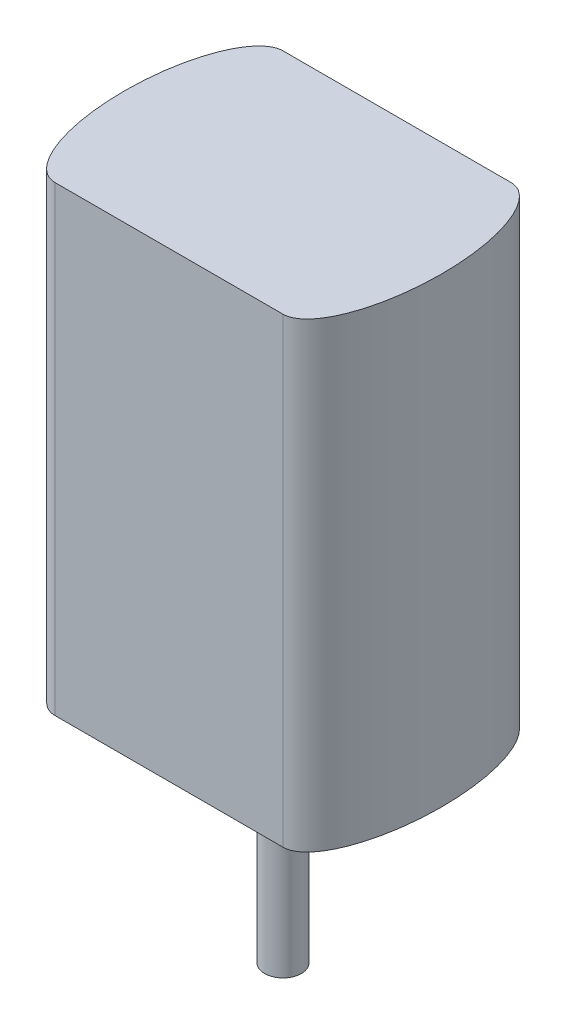
ISO-10303-21;
HEADER;
FILE_DESCRIPTION(('STEP AP214'),'2;1');
FILE_NAME('part.step','',(''),(''),'','','');
FILE_SCHEMA(('AUTOMOTIVE_DESIGN { 1 0 10303 214 1 1 1 1 }'));
ENDSEC;
DATA;
#1=APPLICATION_CONTEXT('core data for automotive mechanical design processes');
#2=APPLICATION_PROTOCOL_DEFINITION('international standard','automotive_design',2000,#1);
#3=PRODUCT_CONTEXT('',#1,'mechanical');
#4=PRODUCT('Part','Part','',(#3));
#5=PRODUCT_RELATED_PRODUCT_CATEGORY('part','',(#4));
#6=PRODUCT_DEFINITION_FORMATION('','',#4);
#7=PRODUCT_DEFINITION_CONTEXT('part definition',#1,'design');
#8=PRODUCT_DEFINITION('design','',#6,#7);
#9=PRODUCT_DEFINITION_SHAPE('','',#8);
#10=(LENGTH_UNIT() NAMED_UNIT(*) SI_UNIT(.MILLI.,.METRE.));
#11=(NAMED_UNIT(*) PLANE_ANGLE_UNIT() SI_UNIT($,.RADIAN.));
#12=(NAMED_UNIT(*) SI_UNIT($,.STERADIAN.) SOLID_ANGLE_UNIT());
#13=UNCERTAINTY_MEASURE_WITH_UNIT(LENGTH_MEASURE(1.E-05),#10,'distance_accuracy_value','');
#14=(GEOMETRIC_REPRESENTATION_CONTEXT(3) GLOBAL_UNCERTAINTY_ASSIGNED_CONTEXT((#13)) GLOBAL_UNIT_ASSIGNED_CONTEXT((#10,
#11,#12)) REPRESENTATION_CONTEXT('',''));
#15=CARTESIAN_POINT('',(0.,0.,0.));
#16=DIRECTION('',(0.,0.,1.));
#17=DIRECTION('',(1.,0.,0.));
#18=AXIS2_PLACEMENT_3D('',#15,#16,#17);
#19=CARTESIAN_POINT('',(0.,0.,0.));
#20=DIRECTION('',(0.,1.,0.));
#21=DIRECTION('',(0.,0.,1.));
#22=AXIS2_PLACEMENT_3D('',#19,#20,#21);
#23=PLANE('',#22);
#24=CARTESIAN_POINT('',(0.,0.,0.));
#25=DIRECTION('',(0.,-1.,0.));
#26=DIRECTION('',(0.,0.,-1.));
#27=AXIS2_PLACEMENT_3D('',#24,#25,#26);
#28=CIRCLE('',#27,3.075);
#29=CARTESIAN_POINT('',(0.,0.,-3.075));
#30=VERTEX_POINT('',#29);
#31=EDGE_CURVE('E106',#30,#30,#28,.T.);
#32=ORIENTED_EDGE('',*,*,#31,.F.);
#33=EDGE_LOOP('',(#32));
#34=FACE_BOUND('',#33,.T.);
#35=DIRECTION('',(1.,0.,0.));
#36=VECTOR('',#35,1.);
#37=CARTESIAN_POINT('',(0.,0.,-6.2));
#38=LINE('',#37,#36);
#39=CARTESIAN_POINT('',(-6.2,0.,-6.2));
#40=VERTEX_POINT('',#39);
#41=CARTESIAN_POINT('',(6.2,0.,-6.2));
#42=VERTEX_POINT('',#41);
#43=EDGE_CURVE('E149',#40,#42,#38,.T.);
#44=ORIENTED_EDGE('',*,*,#43,.T.);
#45=CARTESIAN_POINT('',(6.2,0.,0.));
#46=DIRECTION('',(0.,1.,0.));
#47=DIRECTION('',(0.,0.,1.));
#48=AXIS2_PLACEMENT_3D('',#45,#46,#47);
#49=ELLIPSE('',#48,6.2,2.41724044814929);
#50=CARTESIAN_POINT('',(6.2,0.,6.2));
#51=VERTEX_POINT('',#50);
#52=EDGE_CURVE('E159',#51,#42,#49,.T.);
#53=ORIENTED_EDGE('',*,*,#52,.F.);
#54=DIRECTION('',(-1.,0.,0.));
#55=VECTOR('',#54,1.);
#56=CARTESIAN_POINT('',(0.,0.,6.2));
#57=LINE('',#56,#55);
#58=CARTESIAN_POINT('',(-6.2,0.,6.2));
#59=VERTEX_POINT('',#58);
#60=EDGE_CURVE('E168',#51,#59,#57,.T.);
#61=ORIENTED_EDGE('',*,*,#60,.T.);
#62=CARTESIAN_POINT('',(-6.2,0.,0.));
#63=DIRECTION('',(0.,1.,0.));
#64=DIRECTION('',(0.,0.,1.));
#65=AXIS2_PLACEMENT_3D('',#62,#63,#64);
#66=ELLIPSE('',#65,6.2,2.42896284111755);
#67=EDGE_CURVE('E100',#40,#59,#66,.T.);
#68=ORIENTED_EDGE('',*,*,#67,.F.);
#69=EDGE_LOOP('',(#44,#53,#61,#68));
#70=FACE_BOUND('',#69,.T.);
#71=ADVANCED_FACE('F95',(#34,#70),#23,.F.);
#72=CARTESIAN_POINT('',(0.,25.1,-6.2));
#73=DIRECTION('',(0.,0.,-1.));
#74=DIRECTION('',(-1.,0.,0.));
#75=AXIS2_PLACEMENT_3D('',#72,#73,#74);
#76=PLANE('',#75);
#77=ORIENTED_EDGE('',*,*,#43,.F.);
#78=DIRECTION('',(0.,-1.,0.));
#79=VECTOR('',#78,1.);
#80=CARTESIAN_POINT('',(-6.2,25.1,-6.2));
#81=LINE('',#80,#79);
#82=CARTESIAN_POINT('',(-6.2,25.1,-6.2));
#83=VERTEX_POINT('',#82);
#84=EDGE_CURVE('E143',#83,#40,#81,.T.);
#85=ORIENTED_EDGE('',*,*,#84,.F.);
#86=DIRECTION('',(1.,0.,0.));
#87=VECTOR('',#86,1.);
#88=CARTESIAN_POINT('',(0.,25.1,-6.2));
#89=LINE('',#88,#87);
#90=CARTESIAN_POINT('',(6.2,25.1,-6.2));
#91=VERTEX_POINT('',#90);
#92=EDGE_CURVE('E147',#83,#91,#89,.T.);
#93=ORIENTED_EDGE('',*,*,#92,.T.);
#94=DIRECTION('',(0.,-1.,0.));
#95=VECTOR('',#94,1.);
#96=CARTESIAN_POINT('',(6.2,25.1,-6.2));
#97=LINE('',#96,#95);
#98=EDGE_CURVE('E137',#91,#42,#97,.T.);
#99=ORIENTED_EDGE('',*,*,#98,.T.);
#100=EDGE_LOOP('',(#77,#85,#93,#99));
#101=FACE_BOUND('',#100,.T.);
#102=ADVANCED_FACE('F145',(#101),#76,.T.);
#103=CARTESIAN_POINT('',(0.,25.1,6.2));
#104=DIRECTION('',(0.,0.,1.));
#105=DIRECTION('',(1.,0.,0.));
#106=AXIS2_PLACEMENT_3D('',#103,#104,#105);
#107=PLANE('',#106);
#108=ORIENTED_EDGE('',*,*,#60,.F.);
#109=DIRECTION('',(0.,-1.,0.));
#110=VECTOR('',#109,1.);
#111=CARTESIAN_POINT('',(6.2,25.1,6.2));
#112=LINE('',#111,#110);
#113=CARTESIAN_POINT('',(6.2,25.1,6.2));
#114=VERTEX_POINT('',#113);
#115=EDGE_CURVE('E115',#114,#51,#112,.T.);
#116=ORIENTED_EDGE('',*,*,#115,.F.);
#117=DIRECTION('',(-1.,0.,0.));
#118=VECTOR('',#117,1.);
#119=CARTESIAN_POINT('',(0.,25.1,6.2));
#120=LINE('',#119,#118);
#121=CARTESIAN_POINT('',(-6.2,25.1,6.2));
#122=VERTEX_POINT('',#121);
#123=EDGE_CURVE('E163',#114,#122,#120,.T.);
#124=ORIENTED_EDGE('',*,*,#123,.T.);
#125=DIRECTION('',(0.,-1.,0.));
#126=VECTOR('',#125,1.);
#127=CARTESIAN_POINT('',(-6.2,25.1,6.2));
#128=LINE('',#127,#126);
#129=EDGE_CURVE('E129',#122,#59,#128,.T.);
#130=ORIENTED_EDGE('',*,*,#129,.T.);
#131=EDGE_LOOP('',(#108,#116,#124,#130));
#132=FACE_BOUND('',#131,.T.);
#133=ADVANCED_FACE('F221',(#132),#107,.T.);
#134=CARTESIAN_POINT('',(0.,25.1,0.));
#135=DIRECTION('',(0.,1.,0.));
#136=DIRECTION('',(0.,0.,1.));
#137=AXIS2_PLACEMENT_3D('',#134,#135,#136);
#138=PLANE('',#137);
#139=ORIENTED_EDGE('',*,*,#123,.F.);
#140=CARTESIAN_POINT('',(6.2,25.1,0.));
#141=DIRECTION('',(0.,1.,0.));
#142=DIRECTION('',(0.,0.,1.));
#143=AXIS2_PLACEMENT_3D('',#140,#141,#142);
#144=ELLIPSE('',#143,6.2,2.41724044814929);
#145=EDGE_CURVE('E161',#114,#91,#144,.T.);
#146=ORIENTED_EDGE('',*,*,#145,.T.);
#147=ORIENTED_EDGE('',*,*,#92,.F.);
#148=CARTESIAN_POINT('',(-6.2,25.1,0.));
#149=DIRECTION('',(0.,1.,0.));
#150=DIRECTION('',(0.,0.,1.));
#151=AXIS2_PLACEMENT_3D('',#148,#149,#150);
#152=ELLIPSE('',#151,6.2,2.42896284111755);
#153=EDGE_CURVE('E155',#83,#122,#152,.T.);
#154=ORIENTED_EDGE('',*,*,#153,.T.);
#155=EDGE_LOOP('',(#139,#146,#147,#154));
#156=FACE_BOUND('',#155,.T.);
#157=ADVANCED_FACE('F160',(#156),#138,.T.);
#158=DIRECTION('',(0.,-1.,0.));
#159=VECTOR('',#158,1.);
#160=SURFACE_OF_LINEAR_EXTRUSION('',#144,#159);
#161=ORIENTED_EDGE('',*,*,#52,.T.);
#162=ORIENTED_EDGE('',*,*,#98,.F.);
#163=ORIENTED_EDGE('',*,*,#145,.F.);
#164=ORIENTED_EDGE('',*,*,#115,.T.);
#165=EDGE_LOOP('',(#161,#162,#163,#164));
#166=FACE_BOUND('',#165,.T.);
#167=ADVANCED_FACE('F220',(#166),#160,.F.);
#168=DIRECTION('',(0.,-1.,0.));
#169=VECTOR('',#168,1.);
#170=SURFACE_OF_LINEAR_EXTRUSION('',#152,#169);
#171=ORIENTED_EDGE('',*,*,#84,.T.);
#172=ORIENTED_EDGE('',*,*,#67,.T.);
#173=ORIENTED_EDGE('',*,*,#129,.F.);
#174=ORIENTED_EDGE('',*,*,#153,.F.);
#175=EDGE_LOOP('',(#171,#172,#173,#174));
#176=FACE_BOUND('',#175,.T.);
#177=ADVANCED_FACE('F97',(#176),#170,.F.);
#178=CARTESIAN_POINT('',(0.,-1.6,0.));
#179=DIRECTION('',(0.,1.,0.));
#180=DIRECTION('',(0.,0.,1.));
#181=AXIS2_PLACEMENT_3D('',#178,#179,#180);
#182=CYLINDRICAL_SURFACE('',#181,3.075);
#183=CARTESIAN_POINT('',(0.,-1.6,0.));
#184=DIRECTION('',(0.,-1.,0.));
#185=DIRECTION('',(0.,0.,-1.));
#186=AXIS2_PLACEMENT_3D('',#183,#184,#185);
#187=CIRCLE('',#186,3.075);
#188=CARTESIAN_POINT('',(0.,-1.6,-3.075));
#189=VERTEX_POINT('',#188);
#190=EDGE_CURVE('E191',#189,#189,#187,.T.);
#191=ORIENTED_EDGE('',*,*,#190,.F.);
#192=EDGE_LOOP('',(#191));
#193=FACE_BOUND('',#192,.T.);
#194=ORIENTED_EDGE('',*,*,#31,.T.);
#195=EDGE_LOOP('',(#194));
#196=FACE_BOUND('',#195,.T.);
#197=ADVANCED_FACE('F211',(#193,#196),#182,.T.);
#198=CARTESIAN_POINT('',(0.,-1.6,0.));
#199=DIRECTION('',(0.,-1.,0.));
#200=DIRECTION('',(0.,0.,-1.));
#201=AXIS2_PLACEMENT_3D('',#198,#199,#200);
#202=PLANE('',#201);
#203=CARTESIAN_POINT('',(0.,-1.6,0.));
#204=DIRECTION('',(0.,-1.,0.));
#205=DIRECTION('',(0.,0.,-1.));
#206=AXIS2_PLACEMENT_3D('',#203,#204,#205);
#207=CIRCLE('',#206,1.);
#208=CARTESIAN_POINT('',(0.,-1.6,-1.));
#209=VERTEX_POINT('',#208);
#210=EDGE_CURVE('E12',#209,#209,#207,.T.);
#211=ORIENTED_EDGE('',*,*,#210,.F.);
#212=EDGE_LOOP('',(#211));
#213=FACE_BOUND('',#212,.T.);
#214=ORIENTED_EDGE('',*,*,#190,.T.);
#215=EDGE_LOOP('',(#214));
#216=FACE_BOUND('',#215,.T.);
#217=ADVANCED_FACE('F205',(#213,#216),#202,.T.);
#218=CARTESIAN_POINT('',(0.,-11.65,0.));
#219=DIRECTION('',(0.,1.,0.));
#220=DIRECTION('',(0.,0.,1.));
#221=AXIS2_PLACEMENT_3D('',#218,#219,#220);
#222=CYLINDRICAL_SURFACE('',#221,1.);
#223=CARTESIAN_POINT('',(0.,-11.65,0.));
#224=DIRECTION('',(0.,-1.,0.));
#225=DIRECTION('',(0.,0.,-1.));
#226=AXIS2_PLACEMENT_3D('',#223,#224,#225);
#227=CIRCLE('',#226,1.);
#228=CARTESIAN_POINT('',(0.,-11.65,-1.));
#229=VERTEX_POINT('',#228);
#230=EDGE_CURVE('E194',#229,#229,#227,.T.);
#231=ORIENTED_EDGE('',*,*,#230,.F.);
#232=EDGE_LOOP('',(#231));
#233=FACE_BOUND('',#232,.T.);
#234=ORIENTED_EDGE('',*,*,#210,.T.);
#235=EDGE_LOOP('',(#234));
#236=FACE_BOUND('',#235,.T.);
#237=ADVANCED_FACE('F202',(#233,#236),#222,.T.);
#238=CARTESIAN_POINT('',(0.,-11.65,0.));
#239=DIRECTION('',(0.,-1.,0.));
#240=DIRECTION('',(0.,0.,-1.));
#241=AXIS2_PLACEMENT_3D('',#238,#239,#240);
#242=PLANE('',#241);
#243=ORIENTED_EDGE('',*,*,#230,.T.);
#244=EDGE_LOOP('',(#243));
#245=FACE_BOUND('',#244,.T.);
#246=ADVANCED_FACE('F200',(#245),#242,.T.);
#247=CLOSED_SHELL('',(#71,#102,#133,#157,#167,#177,#197,#217,#237,#246));
#248=MANIFOLD_SOLID_BREP('B2',#247);
#249=ADVANCED_BREP_SHAPE_REPRESENTATION('',(#18,#248),#14);
#250=SHAPE_DEFINITION_REPRESENTATION(#9,#249);
ENDSEC;
END-ISO-10303-21;
